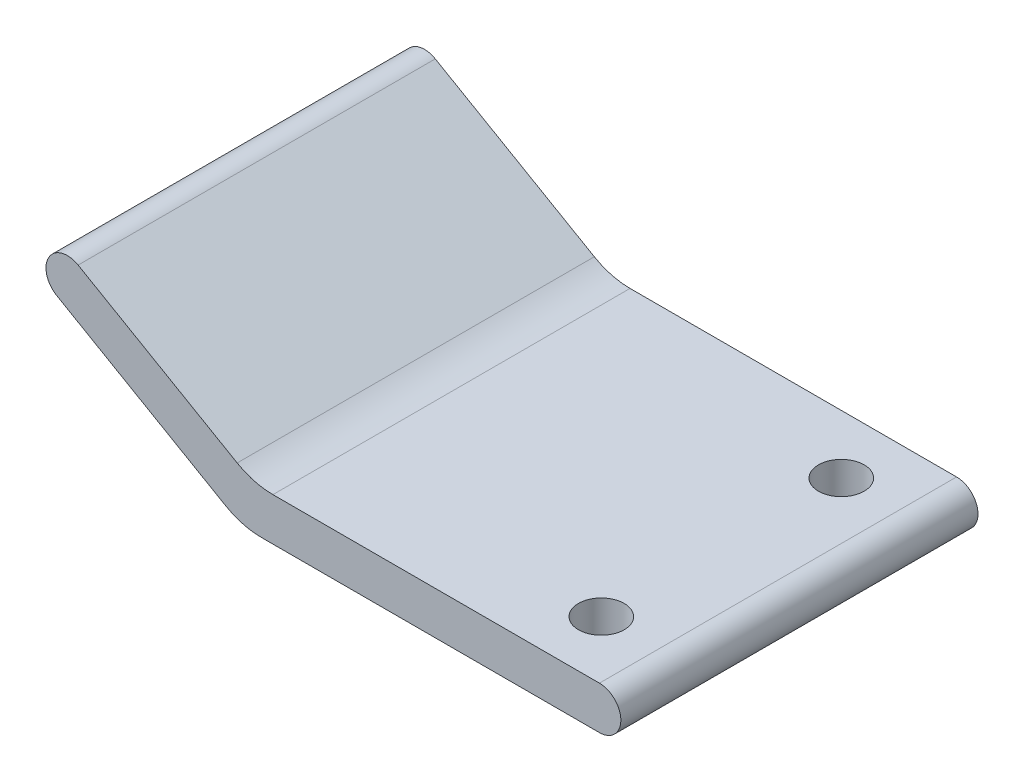
ISO-10303-21;
HEADER;
FILE_DESCRIPTION(('STEP AP214'),'2;1');
FILE_NAME('part.step','',(''),(''),'','','');
FILE_SCHEMA(('AUTOMOTIVE_DESIGN { 1 0 10303 214 1 1 1 1 }'));
ENDSEC;
DATA;
#1=APPLICATION_CONTEXT('core data for automotive mechanical design processes');
#2=APPLICATION_PROTOCOL_DEFINITION('international standard','automotive_design',2000,#1);
#3=PRODUCT_CONTEXT('',#1,'mechanical');
#4=PRODUCT('Part','Part','',(#3));
#5=PRODUCT_RELATED_PRODUCT_CATEGORY('part','',(#4));
#6=PRODUCT_DEFINITION_FORMATION('','',#4);
#7=PRODUCT_DEFINITION_CONTEXT('part definition',#1,'design');
#8=PRODUCT_DEFINITION('design','',#6,#7);
#9=PRODUCT_DEFINITION_SHAPE('','',#8);
#10=(LENGTH_UNIT() NAMED_UNIT(*) SI_UNIT(.MILLI.,.METRE.));
#11=(NAMED_UNIT(*) PLANE_ANGLE_UNIT() SI_UNIT($,.RADIAN.));
#12=(NAMED_UNIT(*) SI_UNIT($,.STERADIAN.) SOLID_ANGLE_UNIT());
#13=UNCERTAINTY_MEASURE_WITH_UNIT(LENGTH_MEASURE(1.E-05),#10,'distance_accuracy_value','');
#14=(GEOMETRIC_REPRESENTATION_CONTEXT(3) GLOBAL_UNCERTAINTY_ASSIGNED_CONTEXT((#13)) GLOBAL_UNIT_ASSIGNED_CONTEXT((#10,
#11,#12)) REPRESENTATION_CONTEXT('',''));
#15=CARTESIAN_POINT('',(0.,0.,0.));
#16=DIRECTION('',(0.,0.,1.));
#17=DIRECTION('',(1.,0.,0.));
#18=AXIS2_PLACEMENT_3D('',#15,#16,#17);
#19=CARTESIAN_POINT('',(0.,1.5,12.5));
#20=DIRECTION('',(0.,0.,-1.));
#21=DIRECTION('',(-1.,0.,0.));
#22=AXIS2_PLACEMENT_3D('',#19,#20,#21);
#23=CYLINDRICAL_SURFACE('',#22,1.5);
#24=CARTESIAN_POINT('',(0.,1.5,-12.5));
#25=DIRECTION('',(0.,0.,1.));
#26=DIRECTION('',(1.,0.,0.));
#27=AXIS2_PLACEMENT_3D('',#24,#25,#26);
#28=CIRCLE('',#27,1.5);
#29=CARTESIAN_POINT('',(0.,0.,-12.5));
#30=VERTEX_POINT('',#29);
#31=CARTESIAN_POINT('',(0.,3.,-12.5));
#32=VERTEX_POINT('',#31);
#33=EDGE_CURVE('E138',#30,#32,#28,.T.);
#34=ORIENTED_EDGE('',*,*,#33,.T.);
#35=DIRECTION('',(0.,0.,-1.));
#36=VECTOR('',#35,1.);
#37=CARTESIAN_POINT('',(0.,3.,12.5));
#38=LINE('',#37,#36);
#39=CARTESIAN_POINT('',(0.,3.,12.5));
#40=VERTEX_POINT('',#39);
#41=EDGE_CURVE('E117',#40,#32,#38,.T.);
#42=ORIENTED_EDGE('',*,*,#41,.F.);
#43=CARTESIAN_POINT('',(0.,1.5,12.5));
#44=DIRECTION('',(0.,0.,1.));
#45=DIRECTION('',(1.,0.,0.));
#46=AXIS2_PLACEMENT_3D('',#43,#44,#45);
#47=CIRCLE('',#46,1.5);
#48=CARTESIAN_POINT('',(0.,0.,12.5));
#49=VERTEX_POINT('',#48);
#50=EDGE_CURVE('E125',#49,#40,#47,.T.);
#51=ORIENTED_EDGE('',*,*,#50,.F.);
#52=DIRECTION('',(0.,0.,-1.));
#53=VECTOR('',#52,1.);
#54=CARTESIAN_POINT('',(0.,0.,12.5));
#55=LINE('',#54,#53);
#56=EDGE_CURVE('E191',#49,#30,#55,.T.);
#57=ORIENTED_EDGE('',*,*,#56,.T.);
#58=EDGE_LOOP('',(#34,#42,#51,#57));
#59=FACE_BOUND('',#58,.T.);
#60=ADVANCED_FACE('F45',(#59),#23,.T.);
#61=CARTESIAN_POINT('',(0.,3.,12.5));
#62=DIRECTION('',(0.,-1.,0.));
#63=DIRECTION('',(1.,0.,0.));
#64=AXIS2_PLACEMENT_3D('',#61,#62,#63);
#65=PLANE('',#64);
#66=CARTESIAN_POINT('',(-3.96816899732389,3.,-8.4));
#67=DIRECTION('',(0.,-1.,0.));
#68=DIRECTION('',(1.,0.,0.));
#69=AXIS2_PLACEMENT_3D('',#66,#67,#68);
#70=CIRCLE('',#69,1.6);
#71=CARTESIAN_POINT('',(-2.36816899732389,3.,-8.4));
#72=VERTEX_POINT('',#71);
#73=EDGE_CURVE('E324',#72,#72,#70,.F.);
#74=ORIENTED_EDGE('',*,*,#73,.F.);
#75=EDGE_LOOP('',(#74));
#76=FACE_BOUND('',#75,.T.);
#77=CARTESIAN_POINT('',(-3.96816899732389,3.,8.4));
#78=DIRECTION('',(0.,-1.,0.));
#79=DIRECTION('',(1.,0.,0.));
#80=AXIS2_PLACEMENT_3D('',#77,#78,#79);
#81=CIRCLE('',#80,1.6);
#82=CARTESIAN_POINT('',(-2.36816899732389,3.,8.4));
#83=VERTEX_POINT('',#82);
#84=EDGE_CURVE('E193',#83,#83,#81,.T.);
#85=ORIENTED_EDGE('',*,*,#84,.T.);
#86=EDGE_LOOP('',(#85));
#87=FACE_BOUND('',#86,.T.);
#88=DIRECTION('',(-1.,0.,0.));
#89=VECTOR('',#88,1.);
#90=CARTESIAN_POINT('',(0.,3.,-12.5));
#91=LINE('',#90,#89);
#92=CARTESIAN_POINT('',(-22.856406460551,3.,-12.5));
#93=VERTEX_POINT('',#92);
#94=EDGE_CURVE('E167',#32,#93,#91,.T.);
#95=ORIENTED_EDGE('',*,*,#94,.T.);
#96=DIRECTION('',(0.,0.,-1.));
#97=VECTOR('',#96,1.);
#98=CARTESIAN_POINT('',(-22.856406460551,3.,12.5));
#99=LINE('',#98,#97);
#100=CARTESIAN_POINT('',(-22.856406460551,3.,12.5));
#101=VERTEX_POINT('',#100);
#102=EDGE_CURVE('E120',#93,#101,#99,.F.);
#103=ORIENTED_EDGE('',*,*,#102,.T.);
#104=DIRECTION('',(-1.,0.,0.));
#105=VECTOR('',#104,1.);
#106=CARTESIAN_POINT('',(0.,3.,12.5));
#107=LINE('',#106,#105);
#108=EDGE_CURVE('E112',#40,#101,#107,.T.);
#109=ORIENTED_EDGE('',*,*,#108,.F.);
#110=ORIENTED_EDGE('',*,*,#41,.T.);
#111=EDGE_LOOP('',(#95,#103,#109,#110));
#112=FACE_BOUND('',#111,.T.);
#113=ADVANCED_FACE('F115',(#76,#87,#112),#65,.F.);
#114=CARTESIAN_POINT('',(-24.1961524227066,3.,12.5));
#115=DIRECTION('',(-0.500000000000001,-0.866025403784438,0.));
#116=DIRECTION('',(0.866025403784438,-0.500000000000001,0.));
#117=AXIS2_PLACEMENT_3D('',#114,#115,#116);
#118=PLANE('',#117);
#119=DIRECTION('',(-0.866025403784438,0.500000000000001,0.));
#120=VECTOR('',#119,1.);
#121=CARTESIAN_POINT('',(-24.1961524227066,3.,12.5));
#122=LINE('',#121,#120);
#123=CARTESIAN_POINT('',(-25.356406460551,3.66987298107781,12.5));
#124=VERTEX_POINT('',#123);
#125=CARTESIAN_POINT('',(-36.4903810567666,10.0980762113533,12.5));
#126=VERTEX_POINT('',#125);
#127=EDGE_CURVE('E124',#124,#126,#122,.T.);
#128=ORIENTED_EDGE('',*,*,#127,.F.);
#129=DIRECTION('',(0.,0.,-1.));
#130=VECTOR('',#129,1.);
#131=CARTESIAN_POINT('',(-25.356406460551,3.66987298107781,-12.5));
#132=LINE('',#131,#130);
#133=CARTESIAN_POINT('',(-25.356406460551,3.66987298107781,-12.5));
#134=VERTEX_POINT('',#133);
#135=EDGE_CURVE('E140',#124,#134,#132,.T.);
#136=ORIENTED_EDGE('',*,*,#135,.T.);
#137=DIRECTION('',(-0.866025403784438,0.500000000000001,0.));
#138=VECTOR('',#137,1.);
#139=CARTESIAN_POINT('',(-24.1961524227066,3.,-12.5));
#140=LINE('',#139,#138);
#141=CARTESIAN_POINT('',(-36.4903810567666,10.0980762113533,-12.5));
#142=VERTEX_POINT('',#141);
#143=EDGE_CURVE('E169',#134,#142,#140,.T.);
#144=ORIENTED_EDGE('',*,*,#143,.T.);
#145=DIRECTION('',(0.,0.,-1.));
#146=VECTOR('',#145,1.);
#147=CARTESIAN_POINT('',(-36.4903810567666,10.0980762113533,12.5));
#148=LINE('',#147,#146);
#149=EDGE_CURVE('E141',#126,#142,#148,.T.);
#150=ORIENTED_EDGE('',*,*,#149,.F.);
#151=EDGE_LOOP('',(#128,#136,#144,#150));
#152=FACE_BOUND('',#151,.T.);
#153=ADVANCED_FACE('F178',(#152),#118,.F.);
#154=CARTESIAN_POINT('',(-37.2403810567666,8.79903810567667,12.5));
#155=DIRECTION('',(0.,0.,-1.));
#156=DIRECTION('',(-1.,0.,0.));
#157=AXIS2_PLACEMENT_3D('',#154,#155,#156);
#158=CYLINDRICAL_SURFACE('',#157,1.5);
#159=CARTESIAN_POINT('',(-37.2403810567666,8.79903810567667,-12.5));
#160=DIRECTION('',(0.,0.,1.));
#161=DIRECTION('',(-1.,0.,0.));
#162=AXIS2_PLACEMENT_3D('',#159,#160,#161);
#163=CIRCLE('',#162,1.5);
#164=CARTESIAN_POINT('',(-37.9903810567666,7.50000000000001,-12.5));
#165=VERTEX_POINT('',#164);
#166=EDGE_CURVE('E197',#142,#165,#163,.T.);
#167=ORIENTED_EDGE('',*,*,#166,.T.);
#168=DIRECTION('',(0.,0.,-1.));
#169=VECTOR('',#168,1.);
#170=CARTESIAN_POINT('',(-37.9903810567666,7.50000000000001,12.5));
#171=LINE('',#170,#169);
#172=CARTESIAN_POINT('',(-37.9903810567666,7.50000000000001,12.5));
#173=VERTEX_POINT('',#172);
#174=EDGE_CURVE('E148',#173,#165,#171,.T.);
#175=ORIENTED_EDGE('',*,*,#174,.F.);
#176=CARTESIAN_POINT('',(-37.2403810567666,8.79903810567667,12.5));
#177=DIRECTION('',(0.,0.,1.));
#178=DIRECTION('',(-1.,0.,0.));
#179=AXIS2_PLACEMENT_3D('',#176,#177,#178);
#180=CIRCLE('',#179,1.5);
#181=EDGE_CURVE('E181',#126,#173,#180,.T.);
#182=ORIENTED_EDGE('',*,*,#181,.F.);
#183=ORIENTED_EDGE('',*,*,#149,.T.);
#184=EDGE_LOOP('',(#167,#175,#182,#183));
#185=FACE_BOUND('',#184,.T.);
#186=ADVANCED_FACE('F211',(#185),#158,.T.);
#187=CARTESIAN_POINT('',(-25.,0.,12.5));
#188=DIRECTION('',(0.500000000000001,0.866025403784438,0.));
#189=DIRECTION('',(-0.866025403784438,0.500000000000001,0.));
#190=AXIS2_PLACEMENT_3D('',#187,#188,#189);
#191=PLANE('',#190);
#192=DIRECTION('',(0.866025403784438,-0.500000000000001,0.));
#193=VECTOR('',#192,1.);
#194=CARTESIAN_POINT('',(-25.,0.,-12.5));
#195=LINE('',#194,#193);
#196=CARTESIAN_POINT('',(-26.1602540378444,0.669872981077808,-12.5));
#197=VERTEX_POINT('',#196);
#198=EDGE_CURVE('E200',#165,#197,#195,.T.);
#199=ORIENTED_EDGE('',*,*,#198,.T.);
#200=DIRECTION('',(0.,0.,-1.));
#201=VECTOR('',#200,1.);
#202=CARTESIAN_POINT('',(-26.1602540378444,0.669872981077808,12.5));
#203=LINE('',#202,#201);
#204=CARTESIAN_POINT('',(-26.1602540378444,0.669872981077808,12.5));
#205=VERTEX_POINT('',#204);
#206=EDGE_CURVE('E61',#197,#205,#203,.F.);
#207=ORIENTED_EDGE('',*,*,#206,.T.);
#208=DIRECTION('',(0.866025403784438,-0.500000000000001,0.));
#209=VECTOR('',#208,1.);
#210=CARTESIAN_POINT('',(-25.,0.,12.5));
#211=LINE('',#210,#209);
#212=EDGE_CURVE('E184',#173,#205,#211,.T.);
#213=ORIENTED_EDGE('',*,*,#212,.F.);
#214=ORIENTED_EDGE('',*,*,#174,.T.);
#215=EDGE_LOOP('',(#199,#207,#213,#214));
#216=FACE_BOUND('',#215,.T.);
#217=ADVANCED_FACE('F209',(#216),#191,.F.);
#218=CARTESIAN_POINT('',(0.,0.,12.5));
#219=DIRECTION('',(0.,1.,0.));
#220=DIRECTION('',(-1.,0.,0.));
#221=AXIS2_PLACEMENT_3D('',#218,#219,#220);
#222=PLANE('',#221);
#223=CARTESIAN_POINT('',(-3.96816899732389,0.,-8.4));
#224=DIRECTION('',(0.,-1.,0.));
#225=DIRECTION('',(0.,0.,-1.));
#226=AXIS2_PLACEMENT_3D('',#223,#224,#225);
#227=CIRCLE('',#226,1.6);
#228=CARTESIAN_POINT('',(-3.96816899732389,0.,-10.));
#229=VERTEX_POINT('',#228);
#230=EDGE_CURVE('E321',#229,#229,#227,.T.);
#231=ORIENTED_EDGE('',*,*,#230,.F.);
#232=EDGE_LOOP('',(#231));
#233=FACE_BOUND('',#232,.T.);
#234=CARTESIAN_POINT('',(-3.96816899732389,0.,8.4));
#235=DIRECTION('',(0.,1.,0.));
#236=DIRECTION('',(0.,0.,1.));
#237=AXIS2_PLACEMENT_3D('',#234,#235,#236);
#238=CIRCLE('',#237,1.6);
#239=CARTESIAN_POINT('',(-3.96816899732389,0.,10.));
#240=VERTEX_POINT('',#239);
#241=EDGE_CURVE('E326',#240,#240,#238,.T.);
#242=ORIENTED_EDGE('',*,*,#241,.T.);
#243=EDGE_LOOP('',(#242));
#244=FACE_BOUND('',#243,.T.);
#245=DIRECTION('',(1.,0.,0.));
#246=VECTOR('',#245,1.);
#247=CARTESIAN_POINT('',(0.,0.,12.5));
#248=LINE('',#247,#246);
#249=CARTESIAN_POINT('',(-23.6602540378444,0.,12.5));
#250=VERTEX_POINT('',#249);
#251=EDGE_CURVE('E130',#250,#49,#248,.T.);
#252=ORIENTED_EDGE('',*,*,#251,.F.);
#253=DIRECTION('',(0.,0.,-1.));
#254=VECTOR('',#253,1.);
#255=CARTESIAN_POINT('',(-23.6602540378444,0.,12.5));
#256=LINE('',#255,#254);
#257=CARTESIAN_POINT('',(-23.6602540378444,0.,-12.5));
#258=VERTEX_POINT('',#257);
#259=EDGE_CURVE('E154',#250,#258,#256,.T.);
#260=ORIENTED_EDGE('',*,*,#259,.T.);
#261=DIRECTION('',(1.,0.,0.));
#262=VECTOR('',#261,1.);
#263=CARTESIAN_POINT('',(0.,0.,-12.5));
#264=LINE('',#263,#262);
#265=EDGE_CURVE('E135',#258,#30,#264,.T.);
#266=ORIENTED_EDGE('',*,*,#265,.T.);
#267=ORIENTED_EDGE('',*,*,#56,.F.);
#268=EDGE_LOOP('',(#252,#260,#266,#267));
#269=FACE_BOUND('',#268,.T.);
#270=ADVANCED_FACE('F216',(#233,#244,#269),#222,.F.);
#271=CARTESIAN_POINT('',(0.,1.5,12.5));
#272=DIRECTION('',(0.,0.,1.));
#273=DIRECTION('',(1.,0.,0.));
#274=AXIS2_PLACEMENT_3D('',#271,#272,#273);
#275=PLANE('',#274);
#276=ORIENTED_EDGE('',*,*,#212,.T.);
#277=CARTESIAN_POINT('',(-23.6602540378444,5.,12.5));
#278=DIRECTION('',(0.,0.,1.));
#279=DIRECTION('',(1.,0.,0.));
#280=AXIS2_PLACEMENT_3D('',#277,#278,#279);
#281=CIRCLE('',#280,5.);
#282=EDGE_CURVE('E162',#205,#250,#281,.T.);
#283=ORIENTED_EDGE('',*,*,#282,.T.);
#284=ORIENTED_EDGE('',*,*,#251,.T.);
#285=ORIENTED_EDGE('',*,*,#50,.T.);
#286=ORIENTED_EDGE('',*,*,#108,.T.);
#287=CARTESIAN_POINT('',(-22.856406460551,8.,12.5));
#288=DIRECTION('',(0.,0.,1.));
#289=DIRECTION('',(1.,0.,0.));
#290=AXIS2_PLACEMENT_3D('',#287,#288,#289);
#291=CIRCLE('',#290,5.);
#292=EDGE_CURVE('E11',#101,#124,#291,.F.);
#293=ORIENTED_EDGE('',*,*,#292,.T.);
#294=ORIENTED_EDGE('',*,*,#127,.T.);
#295=ORIENTED_EDGE('',*,*,#181,.T.);
#296=EDGE_LOOP('',(#276,#283,#284,#285,#286,#293,#294,#295));
#297=FACE_BOUND('',#296,.T.);
#298=ADVANCED_FACE('F128',(#297),#275,.T.);
#299=CARTESIAN_POINT('',(0.,1.5,-12.5));
#300=DIRECTION('',(0.,0.,1.));
#301=DIRECTION('',(1.,0.,0.));
#302=AXIS2_PLACEMENT_3D('',#299,#300,#301);
#303=PLANE('',#302);
#304=ORIENTED_EDGE('',*,*,#265,.F.);
#305=CARTESIAN_POINT('',(-23.6602540378444,5.,-12.5));
#306=DIRECTION('',(0.,0.,1.));
#307=DIRECTION('',(1.,0.,0.));
#308=AXIS2_PLACEMENT_3D('',#305,#306,#307);
#309=CIRCLE('',#308,5.);
#310=EDGE_CURVE('E69',#258,#197,#309,.F.);
#311=ORIENTED_EDGE('',*,*,#310,.T.);
#312=ORIENTED_EDGE('',*,*,#198,.F.);
#313=ORIENTED_EDGE('',*,*,#166,.F.);
#314=ORIENTED_EDGE('',*,*,#143,.F.);
#315=CARTESIAN_POINT('',(-22.856406460551,8.,-12.5));
#316=DIRECTION('',(0.,0.,1.));
#317=DIRECTION('',(1.,0.,0.));
#318=AXIS2_PLACEMENT_3D('',#315,#316,#317);
#319=CIRCLE('',#318,5.);
#320=EDGE_CURVE('E54',#134,#93,#319,.T.);
#321=ORIENTED_EDGE('',*,*,#320,.T.);
#322=ORIENTED_EDGE('',*,*,#94,.F.);
#323=ORIENTED_EDGE('',*,*,#33,.F.);
#324=EDGE_LOOP('',(#304,#311,#312,#313,#314,#321,#322,#323));
#325=FACE_BOUND('',#324,.T.);
#326=ADVANCED_FACE('F166',(#325),#303,.F.);
#327=CARTESIAN_POINT('',(-3.96816899732389,0.,8.4));
#328=DIRECTION('',(0.,1.,0.));
#329=DIRECTION('',(0.,0.,1.));
#330=AXIS2_PLACEMENT_3D('',#327,#328,#329);
#331=CYLINDRICAL_SURFACE('',#330,1.6);
#332=ORIENTED_EDGE('',*,*,#241,.F.);
#333=EDGE_LOOP('',(#332));
#334=FACE_BOUND('',#333,.T.);
#335=ORIENTED_EDGE('',*,*,#84,.F.);
#336=EDGE_LOOP('',(#335));
#337=FACE_BOUND('',#336,.T.);
#338=ADVANCED_FACE('F245',(#334,#337),#331,.F.);
#339=CARTESIAN_POINT('',(-3.96816899732389,0.,-8.4));
#340=DIRECTION('',(0.,1.,0.));
#341=DIRECTION('',(0.,0.,1.));
#342=AXIS2_PLACEMENT_3D('',#339,#340,#341);
#343=CYLINDRICAL_SURFACE('',#342,1.6);
#344=ORIENTED_EDGE('',*,*,#230,.T.);
#345=EDGE_LOOP('',(#344));
#346=FACE_BOUND('',#345,.T.);
#347=ORIENTED_EDGE('',*,*,#73,.T.);
#348=EDGE_LOOP('',(#347));
#349=FACE_BOUND('',#348,.T.);
#350=ADVANCED_FACE('F239',(#346,#349),#343,.F.);
#351=CARTESIAN_POINT('',(-22.856406460551,8.,12.5));
#352=DIRECTION('',(0.,0.,1.));
#353=DIRECTION('',(1.,0.,0.));
#354=AXIS2_PLACEMENT_3D('',#351,#352,#353);
#355=CYLINDRICAL_SURFACE('',#354,5.);
#356=ORIENTED_EDGE('',*,*,#292,.F.);
#357=ORIENTED_EDGE('',*,*,#102,.F.);
#358=ORIENTED_EDGE('',*,*,#320,.F.);
#359=ORIENTED_EDGE('',*,*,#135,.F.);
#360=EDGE_LOOP('',(#356,#357,#358,#359));
#361=FACE_BOUND('',#360,.T.);
#362=ADVANCED_FACE('F174',(#361),#355,.F.);
#363=CARTESIAN_POINT('',(-23.6602540378444,5.,12.5));
#364=DIRECTION('',(0.,0.,-1.));
#365=DIRECTION('',(-1.,0.,0.));
#366=AXIS2_PLACEMENT_3D('',#363,#364,#365);
#367=CYLINDRICAL_SURFACE('',#366,5.);
#368=ORIENTED_EDGE('',*,*,#282,.F.);
#369=ORIENTED_EDGE('',*,*,#206,.F.);
#370=ORIENTED_EDGE('',*,*,#310,.F.);
#371=ORIENTED_EDGE('',*,*,#259,.F.);
#372=EDGE_LOOP('',(#368,#369,#370,#371));
#373=FACE_BOUND('',#372,.T.);
#374=ADVANCED_FACE('F47',(#373),#367,.T.);
#375=CLOSED_SHELL('',(#60,#113,#153,#186,#217,#270,#298,#326,#338,#350,#362,#374));
#376=MANIFOLD_SOLID_BREP('B2',#375);
#377=ADVANCED_BREP_SHAPE_REPRESENTATION('',(#18,#376),#14);
#378=SHAPE_DEFINITION_REPRESENTATION(#9,#377);
ENDSEC;
END-ISO-10303-21;
